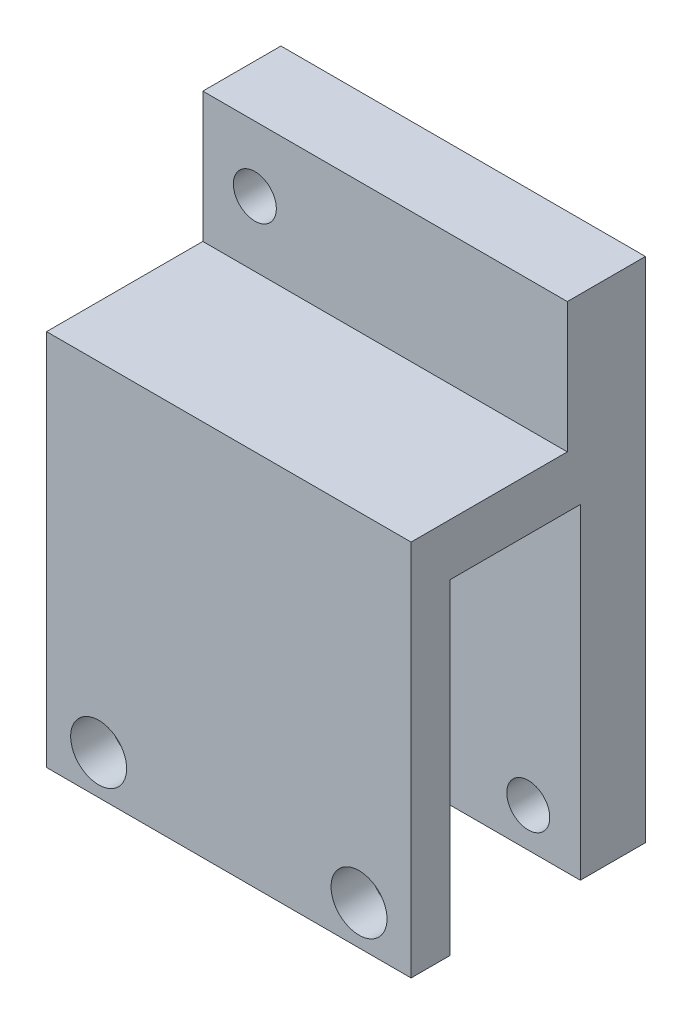
ISO-10303-21;
HEADER;
FILE_DESCRIPTION(('STEP AP214'),'2;1');
FILE_NAME('part.step','',(''),(''),'','','');
FILE_SCHEMA(('AUTOMOTIVE_DESIGN { 1 0 10303 214 1 1 1 1 }'));
ENDSEC;
DATA;
#1=APPLICATION_CONTEXT('core data for automotive mechanical design processes');
#2=APPLICATION_PROTOCOL_DEFINITION('international standard','automotive_design',2000,#1);
#3=PRODUCT_CONTEXT('',#1,'mechanical');
#4=PRODUCT('Part','Part','',(#3));
#5=PRODUCT_RELATED_PRODUCT_CATEGORY('part','',(#4));
#6=PRODUCT_DEFINITION_FORMATION('','',#4);
#7=PRODUCT_DEFINITION_CONTEXT('part definition',#1,'design');
#8=PRODUCT_DEFINITION('design','',#6,#7);
#9=PRODUCT_DEFINITION_SHAPE('','',#8);
#10=(LENGTH_UNIT() NAMED_UNIT(*) SI_UNIT(.MILLI.,.METRE.));
#11=(NAMED_UNIT(*) PLANE_ANGLE_UNIT() SI_UNIT($,.RADIAN.));
#12=(NAMED_UNIT(*) SI_UNIT($,.STERADIAN.) SOLID_ANGLE_UNIT());
#13=UNCERTAINTY_MEASURE_WITH_UNIT(LENGTH_MEASURE(1.E-05),#10,'distance_accuracy_value','');
#14=(GEOMETRIC_REPRESENTATION_CONTEXT(3) GLOBAL_UNCERTAINTY_ASSIGNED_CONTEXT((#13)) GLOBAL_UNIT_ASSIGNED_CONTEXT((#10,
#11,#12)) REPRESENTATION_CONTEXT('',''));
#15=CARTESIAN_POINT('',(0.,0.,0.));
#16=DIRECTION('',(0.,0.,1.));
#17=DIRECTION('',(1.,0.,0.));
#18=AXIS2_PLACEMENT_3D('',#15,#16,#17);
#19=CARTESIAN_POINT('',(14.,0.,0.));
#20=DIRECTION('',(0.,0.,1.));
#21=DIRECTION('',(1.,0.,0.));
#22=AXIS2_PLACEMENT_3D('',#19,#20,#21);
#23=PLANE('',#22);
#24=CARTESIAN_POINT('',(-10.,3.,0.));
#25=DIRECTION('',(0.,0.,-1.));
#26=DIRECTION('',(-1.,0.,0.));
#27=AXIS2_PLACEMENT_3D('',#24,#25,#26);
#28=CIRCLE('',#27,1.64999999999999);
#29=CARTESIAN_POINT('',(-11.65,3.,0.));
#30=VERTEX_POINT('',#29);
#31=EDGE_CURVE('E255',#30,#30,#28,.T.);
#32=ORIENTED_EDGE('',*,*,#31,.F.);
#33=EDGE_LOOP('',(#32));
#34=FACE_BOUND('',#33,.T.);
#35=CARTESIAN_POINT('',(10.,3.,0.));
#36=DIRECTION('',(0.,0.,-1.));
#37=DIRECTION('',(-1.,0.,0.));
#38=AXIS2_PLACEMENT_3D('',#35,#36,#37);
#39=CIRCLE('',#38,1.64999999999999);
#40=CARTESIAN_POINT('',(8.35000000000002,3.,0.));
#41=VERTEX_POINT('',#40);
#42=EDGE_CURVE('E249',#41,#41,#39,.T.);
#43=ORIENTED_EDGE('',*,*,#42,.F.);
#44=EDGE_LOOP('',(#43));
#45=FACE_BOUND('',#44,.T.);
#46=CARTESIAN_POINT('',(-9.99999999999999,34.,0.));
#47=DIRECTION('',(0.,0.,1.));
#48=DIRECTION('',(1.,0.,0.));
#49=AXIS2_PLACEMENT_3D('',#46,#47,#48);
#50=CIRCLE('',#49,1.65);
#51=CARTESIAN_POINT('',(-8.35,34.,0.));
#52=VERTEX_POINT('',#51);
#53=EDGE_CURVE('E172',#52,#52,#50,.T.);
#54=ORIENTED_EDGE('',*,*,#53,.T.);
#55=EDGE_LOOP('',(#54));
#56=FACE_BOUND('',#55,.T.);
#57=DIRECTION('',(0.,1.,0.));
#58=VECTOR('',#57,1.);
#59=CARTESIAN_POINT('',(-14.,0.,0.));
#60=LINE('',#59,#58);
#61=CARTESIAN_POINT('',(-14.,0.,0.));
#62=VERTEX_POINT('',#61);
#63=CARTESIAN_POINT('',(-14.,39.,0.));
#64=VERTEX_POINT('',#63);
#65=EDGE_CURVE('E167',#62,#64,#60,.T.);
#66=ORIENTED_EDGE('',*,*,#65,.T.);
#67=DIRECTION('',(-1.,0.,0.));
#68=VECTOR('',#67,1.);
#69=CARTESIAN_POINT('',(14.,39.,0.));
#70=LINE('',#69,#68);
#71=CARTESIAN_POINT('',(14.,39.,0.));
#72=VERTEX_POINT('',#71);
#73=EDGE_CURVE('E13',#72,#64,#70,.T.);
#74=ORIENTED_EDGE('',*,*,#73,.F.);
#75=DIRECTION('',(0.,1.,0.));
#76=VECTOR('',#75,1.);
#77=CARTESIAN_POINT('',(14.,0.,0.));
#78=LINE('',#77,#76);
#79=CARTESIAN_POINT('',(14.,0.,0.));
#80=VERTEX_POINT('',#79);
#81=EDGE_CURVE('E191',#80,#72,#78,.T.);
#82=ORIENTED_EDGE('',*,*,#81,.F.);
#83=DIRECTION('',(-1.,0.,0.));
#84=VECTOR('',#83,1.);
#85=CARTESIAN_POINT('',(14.,0.,0.));
#86=LINE('',#85,#84);
#87=EDGE_CURVE('E163',#80,#62,#86,.T.);
#88=ORIENTED_EDGE('',*,*,#87,.T.);
#89=EDGE_LOOP('',(#66,#74,#82,#88));
#90=FACE_BOUND('',#89,.T.);
#91=ADVANCED_FACE('F56',(#34,#45,#56,#90),#23,.F.);
#92=CARTESIAN_POINT('',(14.,39.,0.));
#93=DIRECTION('',(0.,-1.,0.));
#94=DIRECTION('',(0.,0.,-1.));
#95=AXIS2_PLACEMENT_3D('',#92,#93,#94);
#96=PLANE('',#95);
#97=DIRECTION('',(0.,0.,1.));
#98=VECTOR('',#97,1.);
#99=CARTESIAN_POINT('',(-14.,39.,0.));
#100=LINE('',#99,#98);
#101=CARTESIAN_POINT('',(-14.,39.,6.));
#102=VERTEX_POINT('',#101);
#103=EDGE_CURVE('E171',#64,#102,#100,.T.);
#104=ORIENTED_EDGE('',*,*,#103,.T.);
#105=DIRECTION('',(-1.,0.,0.));
#106=VECTOR('',#105,1.);
#107=CARTESIAN_POINT('',(14.,39.,6.));
#108=LINE('',#107,#106);
#109=CARTESIAN_POINT('',(14.,39.,6.));
#110=VERTEX_POINT('',#109);
#111=EDGE_CURVE('E64',#110,#102,#108,.T.);
#112=ORIENTED_EDGE('',*,*,#111,.F.);
#113=DIRECTION('',(0.,0.,1.));
#114=VECTOR('',#113,1.);
#115=CARTESIAN_POINT('',(14.,39.,0.));
#116=LINE('',#115,#114);
#117=EDGE_CURVE('E123',#72,#110,#116,.T.);
#118=ORIENTED_EDGE('',*,*,#117,.F.);
#119=ORIENTED_EDGE('',*,*,#73,.T.);
#120=EDGE_LOOP('',(#104,#112,#118,#119));
#121=FACE_BOUND('',#120,.T.);
#122=ADVANCED_FACE('F295',(#121),#96,.F.);
#123=CARTESIAN_POINT('',(14.,39.,6.));
#124=DIRECTION('',(0.,0.,-1.));
#125=DIRECTION('',(0.,1.,0.));
#126=AXIS2_PLACEMENT_3D('',#123,#124,#125);
#127=PLANE('',#126);
#128=CARTESIAN_POINT('',(-9.99999999999999,34.,5.99999999999999));
#129=DIRECTION('',(0.,0.,1.));
#130=DIRECTION('',(1.,0.,0.));
#131=AXIS2_PLACEMENT_3D('',#128,#129,#130);
#132=CIRCLE('',#131,1.65);
#133=CARTESIAN_POINT('',(-8.35,34.,5.99999999999999));
#134=VERTEX_POINT('',#133);
#135=EDGE_CURVE('E243',#134,#134,#132,.T.);
#136=ORIENTED_EDGE('',*,*,#135,.F.);
#137=EDGE_LOOP('',(#136));
#138=FACE_BOUND('',#137,.T.);
#139=DIRECTION('',(0.,-1.,0.));
#140=VECTOR('',#139,1.);
#141=CARTESIAN_POINT('',(-14.,39.,6.));
#142=LINE('',#141,#140);
#143=CARTESIAN_POINT('',(-14.,29.,6.));
#144=VERTEX_POINT('',#143);
#145=EDGE_CURVE('E174',#102,#144,#142,.T.);
#146=ORIENTED_EDGE('',*,*,#145,.T.);
#147=DIRECTION('',(-1.,0.,0.));
#148=VECTOR('',#147,1.);
#149=CARTESIAN_POINT('',(14.,29.,6.));
#150=LINE('',#149,#148);
#151=CARTESIAN_POINT('',(14.,29.,6.));
#152=VERTEX_POINT('',#151);
#153=EDGE_CURVE('E204',#152,#144,#150,.T.);
#154=ORIENTED_EDGE('',*,*,#153,.F.);
#155=DIRECTION('',(0.,-1.,0.));
#156=VECTOR('',#155,1.);
#157=CARTESIAN_POINT('',(14.,39.,6.));
#158=LINE('',#157,#156);
#159=EDGE_CURVE('E213',#110,#152,#158,.T.);
#160=ORIENTED_EDGE('',*,*,#159,.F.);
#161=ORIENTED_EDGE('',*,*,#111,.T.);
#162=EDGE_LOOP('',(#146,#154,#160,#161));
#163=FACE_BOUND('',#162,.T.);
#164=ADVANCED_FACE('F211',(#138,#163),#127,.F.);
#165=CARTESIAN_POINT('',(14.,29.,18.));
#166=DIRECTION('',(0.,-1.,0.));
#167=DIRECTION('',(0.,0.,-1.));
#168=AXIS2_PLACEMENT_3D('',#165,#166,#167);
#169=PLANE('',#168);
#170=DIRECTION('',(0.,0.,1.));
#171=VECTOR('',#170,1.);
#172=CARTESIAN_POINT('',(-14.,29.,18.));
#173=LINE('',#172,#171);
#174=CARTESIAN_POINT('',(-14.,29.,18.));
#175=VERTEX_POINT('',#174);
#176=EDGE_CURVE('E177',#144,#175,#173,.T.);
#177=ORIENTED_EDGE('',*,*,#176,.T.);
#178=DIRECTION('',(-1.,0.,0.));
#179=VECTOR('',#178,1.);
#180=CARTESIAN_POINT('',(14.,29.,18.));
#181=LINE('',#180,#179);
#182=CARTESIAN_POINT('',(14.,29.,18.));
#183=VERTEX_POINT('',#182);
#184=EDGE_CURVE('E201',#183,#175,#181,.T.);
#185=ORIENTED_EDGE('',*,*,#184,.F.);
#186=DIRECTION('',(0.,0.,1.));
#187=VECTOR('',#186,1.);
#188=CARTESIAN_POINT('',(14.,29.,18.));
#189=LINE('',#188,#187);
#190=EDGE_CURVE('E232',#152,#183,#189,.T.);
#191=ORIENTED_EDGE('',*,*,#190,.F.);
#192=ORIENTED_EDGE('',*,*,#153,.T.);
#193=EDGE_LOOP('',(#177,#185,#191,#192));
#194=FACE_BOUND('',#193,.T.);
#195=ADVANCED_FACE('F222',(#194),#169,.F.);
#196=CARTESIAN_POINT('',(14.,0.,18.));
#197=DIRECTION('',(0.,0.,-1.));
#198=DIRECTION('',(-1.,0.,0.));
#199=AXIS2_PLACEMENT_3D('',#196,#197,#198);
#200=PLANE('',#199);
#201=CARTESIAN_POINT('',(-10.,3.,18.));
#202=DIRECTION('',(0.,0.,1.));
#203=DIRECTION('',(1.,0.,0.));
#204=AXIS2_PLACEMENT_3D('',#201,#202,#203);
#205=CIRCLE('',#204,2.15);
#206=CARTESIAN_POINT('',(-7.85000000000001,3.,18.));
#207=VERTEX_POINT('',#206);
#208=EDGE_CURVE('E267',#207,#207,#205,.T.);
#209=ORIENTED_EDGE('',*,*,#208,.F.);
#210=EDGE_LOOP('',(#209));
#211=FACE_BOUND('',#210,.T.);
#212=CARTESIAN_POINT('',(10.,3.,18.));
#213=DIRECTION('',(0.,0.,1.));
#214=DIRECTION('',(1.,0.,0.));
#215=AXIS2_PLACEMENT_3D('',#212,#213,#214);
#216=CIRCLE('',#215,2.15);
#217=CARTESIAN_POINT('',(12.15,3.,18.));
#218=VERTEX_POINT('',#217);
#219=EDGE_CURVE('E261',#218,#218,#216,.T.);
#220=ORIENTED_EDGE('',*,*,#219,.F.);
#221=EDGE_LOOP('',(#220));
#222=FACE_BOUND('',#221,.T.);
#223=DIRECTION('',(0.,-1.,0.));
#224=VECTOR('',#223,1.);
#225=CARTESIAN_POINT('',(-14.,0.,18.));
#226=LINE('',#225,#224);
#227=CARTESIAN_POINT('',(-14.,0.,18.));
#228=VERTEX_POINT('',#227);
#229=EDGE_CURVE('E180',#175,#228,#226,.T.);
#230=ORIENTED_EDGE('',*,*,#229,.T.);
#231=DIRECTION('',(-1.,0.,0.));
#232=VECTOR('',#231,1.);
#233=CARTESIAN_POINT('',(14.,0.,18.));
#234=LINE('',#233,#232);
#235=CARTESIAN_POINT('',(14.,0.,18.));
#236=VERTEX_POINT('',#235);
#237=EDGE_CURVE('E198',#236,#228,#234,.T.);
#238=ORIENTED_EDGE('',*,*,#237,.F.);
#239=DIRECTION('',(0.,-1.,0.));
#240=VECTOR('',#239,1.);
#241=CARTESIAN_POINT('',(14.,0.,18.));
#242=LINE('',#241,#240);
#243=EDGE_CURVE('E228',#183,#236,#242,.T.);
#244=ORIENTED_EDGE('',*,*,#243,.F.);
#245=ORIENTED_EDGE('',*,*,#184,.T.);
#246=EDGE_LOOP('',(#230,#238,#244,#245));
#247=FACE_BOUND('',#246,.T.);
#248=ADVANCED_FACE('F226',(#211,#222,#247),#200,.F.);
#249=CARTESIAN_POINT('',(14.,0.,15.));
#250=DIRECTION('',(0.,1.,0.));
#251=DIRECTION('',(0.,0.,1.));
#252=AXIS2_PLACEMENT_3D('',#249,#250,#251);
#253=PLANE('',#252);
#254=DIRECTION('',(0.,0.,-1.));
#255=VECTOR('',#254,1.);
#256=CARTESIAN_POINT('',(-14.,0.,15.));
#257=LINE('',#256,#255);
#258=CARTESIAN_POINT('',(-14.,0.,15.));
#259=VERTEX_POINT('',#258);
#260=EDGE_CURVE('E182',#228,#259,#257,.T.);
#261=ORIENTED_EDGE('',*,*,#260,.T.);
#262=DIRECTION('',(-1.,0.,0.));
#263=VECTOR('',#262,1.);
#264=CARTESIAN_POINT('',(14.,0.,15.));
#265=LINE('',#264,#263);
#266=CARTESIAN_POINT('',(14.,0.,15.));
#267=VERTEX_POINT('',#266);
#268=EDGE_CURVE('E195',#267,#259,#265,.T.);
#269=ORIENTED_EDGE('',*,*,#268,.F.);
#270=DIRECTION('',(0.,0.,-1.));
#271=VECTOR('',#270,1.);
#272=CARTESIAN_POINT('',(14.,0.,15.));
#273=LINE('',#272,#271);
#274=EDGE_CURVE('E231',#236,#267,#273,.T.);
#275=ORIENTED_EDGE('',*,*,#274,.F.);
#276=ORIENTED_EDGE('',*,*,#237,.T.);
#277=EDGE_LOOP('',(#261,#269,#275,#276));
#278=FACE_BOUND('',#277,.T.);
#279=ADVANCED_FACE('F275',(#278),#253,.F.);
#280=CARTESIAN_POINT('',(14.,0.,15.));
#281=DIRECTION('',(0.,0.,1.));
#282=DIRECTION('',(1.,0.,0.));
#283=AXIS2_PLACEMENT_3D('',#280,#281,#282);
#284=PLANE('',#283);
#285=CARTESIAN_POINT('',(-10.,3.,15.));
#286=DIRECTION('',(0.,0.,1.));
#287=DIRECTION('',(1.,0.,0.));
#288=AXIS2_PLACEMENT_3D('',#285,#286,#287);
#289=CIRCLE('',#288,2.15);
#290=CARTESIAN_POINT('',(-7.85000000000001,3.,15.));
#291=VERTEX_POINT('',#290);
#292=EDGE_CURVE('E264',#291,#291,#289,.T.);
#293=ORIENTED_EDGE('',*,*,#292,.T.);
#294=EDGE_LOOP('',(#293));
#295=FACE_BOUND('',#294,.T.);
#296=CARTESIAN_POINT('',(10.,3.,15.));
#297=DIRECTION('',(0.,0.,1.));
#298=DIRECTION('',(1.,0.,0.));
#299=AXIS2_PLACEMENT_3D('',#296,#297,#298);
#300=CIRCLE('',#299,2.15);
#301=CARTESIAN_POINT('',(12.15,3.,15.));
#302=VERTEX_POINT('',#301);
#303=EDGE_CURVE('E258',#302,#302,#300,.T.);
#304=ORIENTED_EDGE('',*,*,#303,.T.);
#305=EDGE_LOOP('',(#304));
#306=FACE_BOUND('',#305,.T.);
#307=DIRECTION('',(0.,1.,0.));
#308=VECTOR('',#307,1.);
#309=CARTESIAN_POINT('',(-14.,0.,15.));
#310=LINE('',#309,#308);
#311=CARTESIAN_POINT('',(-14.,25.,15.));
#312=VERTEX_POINT('',#311);
#313=EDGE_CURVE('E184',#259,#312,#310,.T.);
#314=ORIENTED_EDGE('',*,*,#313,.T.);
#315=DIRECTION('',(-1.,0.,0.));
#316=VECTOR('',#315,1.);
#317=CARTESIAN_POINT('',(14.,25.,15.));
#318=LINE('',#317,#316);
#319=CARTESIAN_POINT('',(14.,25.,15.));
#320=VERTEX_POINT('',#319);
#321=EDGE_CURVE('E158',#320,#312,#318,.T.);
#322=ORIENTED_EDGE('',*,*,#321,.F.);
#323=DIRECTION('',(0.,1.,0.));
#324=VECTOR('',#323,1.);
#325=CARTESIAN_POINT('',(14.,0.,15.));
#326=LINE('',#325,#324);
#327=EDGE_CURVE('E148',#267,#320,#326,.T.);
#328=ORIENTED_EDGE('',*,*,#327,.F.);
#329=ORIENTED_EDGE('',*,*,#268,.T.);
#330=EDGE_LOOP('',(#314,#322,#328,#329));
#331=FACE_BOUND('',#330,.T.);
#332=ADVANCED_FACE('F310',(#295,#306,#331),#284,.F.);
#333=CARTESIAN_POINT('',(14.,25.,15.));
#334=DIRECTION('',(0.,1.,0.));
#335=DIRECTION('',(0.,0.,1.));
#336=AXIS2_PLACEMENT_3D('',#333,#334,#335);
#337=PLANE('',#336);
#338=DIRECTION('',(0.,0.,-1.));
#339=VECTOR('',#338,1.);
#340=CARTESIAN_POINT('',(-14.,25.,15.));
#341=LINE('',#340,#339);
#342=CARTESIAN_POINT('',(-14.,25.,5.));
#343=VERTEX_POINT('',#342);
#344=EDGE_CURVE('E156',#312,#343,#341,.T.);
#345=ORIENTED_EDGE('',*,*,#344,.T.);
#346=DIRECTION('',(-1.,0.,0.));
#347=VECTOR('',#346,1.);
#348=CARTESIAN_POINT('',(14.,25.,5.));
#349=LINE('',#348,#347);
#350=CARTESIAN_POINT('',(14.,25.,5.));
#351=VERTEX_POINT('',#350);
#352=EDGE_CURVE('E153',#351,#343,#349,.T.);
#353=ORIENTED_EDGE('',*,*,#352,.F.);
#354=DIRECTION('',(0.,0.,-1.));
#355=VECTOR('',#354,1.);
#356=CARTESIAN_POINT('',(14.,25.,15.));
#357=LINE('',#356,#355);
#358=EDGE_CURVE('E142',#320,#351,#357,.T.);
#359=ORIENTED_EDGE('',*,*,#358,.F.);
#360=ORIENTED_EDGE('',*,*,#321,.T.);
#361=EDGE_LOOP('',(#345,#353,#359,#360));
#362=FACE_BOUND('',#361,.T.);
#363=ADVANCED_FACE('F154',(#362),#337,.F.);
#364=CARTESIAN_POINT('',(14.,0.,5.));
#365=DIRECTION('',(0.,0.,-1.));
#366=DIRECTION('',(-1.,0.,0.));
#367=AXIS2_PLACEMENT_3D('',#364,#365,#366);
#368=PLANE('',#367);
#369=CARTESIAN_POINT('',(-10.,3.,5.));
#370=DIRECTION('',(0.,0.,-1.));
#371=DIRECTION('',(-1.,0.,0.));
#372=AXIS2_PLACEMENT_3D('',#369,#370,#371);
#373=CIRCLE('',#372,1.64999999999999);
#374=CARTESIAN_POINT('',(-11.65,3.,5.));
#375=VERTEX_POINT('',#374);
#376=EDGE_CURVE('E252',#375,#375,#373,.T.);
#377=ORIENTED_EDGE('',*,*,#376,.T.);
#378=EDGE_LOOP('',(#377));
#379=FACE_BOUND('',#378,.T.);
#380=CARTESIAN_POINT('',(10.,3.,5.));
#381=DIRECTION('',(0.,0.,-1.));
#382=DIRECTION('',(-1.,0.,0.));
#383=AXIS2_PLACEMENT_3D('',#380,#381,#382);
#384=CIRCLE('',#383,1.64999999999999);
#385=CARTESIAN_POINT('',(8.35000000000001,3.,5.));
#386=VERTEX_POINT('',#385);
#387=EDGE_CURVE('E246',#386,#386,#384,.T.);
#388=ORIENTED_EDGE('',*,*,#387,.T.);
#389=EDGE_LOOP('',(#388));
#390=FACE_BOUND('',#389,.T.);
#391=DIRECTION('',(0.,-1.,0.));
#392=VECTOR('',#391,1.);
#393=CARTESIAN_POINT('',(-14.,0.,5.));
#394=LINE('',#393,#392);
#395=CARTESIAN_POINT('',(-14.,0.,5.));
#396=VERTEX_POINT('',#395);
#397=EDGE_CURVE('E109',#343,#396,#394,.T.);
#398=ORIENTED_EDGE('',*,*,#397,.T.);
#399=DIRECTION('',(-1.,0.,0.));
#400=VECTOR('',#399,1.);
#401=CARTESIAN_POINT('',(14.,0.,5.));
#402=LINE('',#401,#400);
#403=CARTESIAN_POINT('',(14.,0.,5.));
#404=VERTEX_POINT('',#403);
#405=EDGE_CURVE('E159',#404,#396,#402,.T.);
#406=ORIENTED_EDGE('',*,*,#405,.F.);
#407=DIRECTION('',(0.,-1.,0.));
#408=VECTOR('',#407,1.);
#409=CARTESIAN_POINT('',(14.,0.,5.));
#410=LINE('',#409,#408);
#411=EDGE_CURVE('E146',#351,#404,#410,.T.);
#412=ORIENTED_EDGE('',*,*,#411,.F.);
#413=ORIENTED_EDGE('',*,*,#352,.T.);
#414=EDGE_LOOP('',(#398,#406,#412,#413));
#415=FACE_BOUND('',#414,.T.);
#416=ADVANCED_FACE('F161',(#379,#390,#415),#368,.F.);
#417=CARTESIAN_POINT('',(14.,0.,0.));
#418=DIRECTION('',(0.,1.,0.));
#419=DIRECTION('',(0.,0.,1.));
#420=AXIS2_PLACEMENT_3D('',#417,#418,#419);
#421=PLANE('',#420);
#422=DIRECTION('',(0.,0.,-1.));
#423=VECTOR('',#422,1.);
#424=CARTESIAN_POINT('',(-14.,0.,0.));
#425=LINE('',#424,#423);
#426=EDGE_CURVE('E115',#396,#62,#425,.T.);
#427=ORIENTED_EDGE('',*,*,#426,.T.);
#428=ORIENTED_EDGE('',*,*,#87,.F.);
#429=DIRECTION('',(0.,0.,-1.));
#430=VECTOR('',#429,1.);
#431=CARTESIAN_POINT('',(14.,0.,0.));
#432=LINE('',#431,#430);
#433=EDGE_CURVE('E72',#404,#80,#432,.T.);
#434=ORIENTED_EDGE('',*,*,#433,.F.);
#435=ORIENTED_EDGE('',*,*,#405,.T.);
#436=EDGE_LOOP('',(#427,#428,#434,#435));
#437=FACE_BOUND('',#436,.T.);
#438=ADVANCED_FACE('F343',(#437),#421,.F.);
#439=CARTESIAN_POINT('',(14.,0.,0.));
#440=DIRECTION('',(1.,0.,0.));
#441=DIRECTION('',(0.,0.,-1.));
#442=AXIS2_PLACEMENT_3D('',#439,#440,#441);
#443=PLANE('',#442);
#444=ORIENTED_EDGE('',*,*,#81,.T.);
#445=ORIENTED_EDGE('',*,*,#117,.T.);
#446=ORIENTED_EDGE('',*,*,#159,.T.);
#447=ORIENTED_EDGE('',*,*,#190,.T.);
#448=ORIENTED_EDGE('',*,*,#243,.T.);
#449=ORIENTED_EDGE('',*,*,#274,.T.);
#450=ORIENTED_EDGE('',*,*,#327,.T.);
#451=ORIENTED_EDGE('',*,*,#358,.T.);
#452=ORIENTED_EDGE('',*,*,#411,.T.);
#453=ORIENTED_EDGE('',*,*,#433,.T.);
#454=EDGE_LOOP('',(#444,#445,#446,#447,#448,#449,#450,#451,#452,#453));
#455=FACE_BOUND('',#454,.T.);
#456=ADVANCED_FACE('F144',(#455),#443,.T.);
#457=CARTESIAN_POINT('',(-14.,0.,0.));
#458=DIRECTION('',(1.,0.,0.));
#459=DIRECTION('',(0.,0.,-1.));
#460=AXIS2_PLACEMENT_3D('',#457,#458,#459);
#461=PLANE('',#460);
#462=ORIENTED_EDGE('',*,*,#65,.F.);
#463=ORIENTED_EDGE('',*,*,#426,.F.);
#464=ORIENTED_EDGE('',*,*,#397,.F.);
#465=ORIENTED_EDGE('',*,*,#344,.F.);
#466=ORIENTED_EDGE('',*,*,#313,.F.);
#467=ORIENTED_EDGE('',*,*,#260,.F.);
#468=ORIENTED_EDGE('',*,*,#229,.F.);
#469=ORIENTED_EDGE('',*,*,#176,.F.);
#470=ORIENTED_EDGE('',*,*,#145,.F.);
#471=ORIENTED_EDGE('',*,*,#103,.F.);
#472=EDGE_LOOP('',(#462,#463,#464,#465,#466,#467,#468,#469,#470,#471));
#473=FACE_BOUND('',#472,.T.);
#474=ADVANCED_FACE('F217',(#473),#461,.F.);
#475=CARTESIAN_POINT('',(-9.99999999999999,34.,5.99999999999999));
#476=DIRECTION('',(0.,0.,1.));
#477=DIRECTION('',(1.,0.,0.));
#478=AXIS2_PLACEMENT_3D('',#475,#476,#477);
#479=CYLINDRICAL_SURFACE('',#478,1.65);
#480=ORIENTED_EDGE('',*,*,#53,.F.);
#481=EDGE_LOOP('',(#480));
#482=FACE_BOUND('',#481,.T.);
#483=ORIENTED_EDGE('',*,*,#135,.T.);
#484=EDGE_LOOP('',(#483));
#485=FACE_BOUND('',#484,.T.);
#486=ADVANCED_FACE('F330',(#482,#485),#479,.F.);
#487=CARTESIAN_POINT('',(10.,3.,0.));
#488=DIRECTION('',(0.,0.,-1.));
#489=DIRECTION('',(-1.,0.,0.));
#490=AXIS2_PLACEMENT_3D('',#487,#488,#489);
#491=CYLINDRICAL_SURFACE('',#490,1.64999999999999);
#492=ORIENTED_EDGE('',*,*,#387,.F.);
#493=EDGE_LOOP('',(#492));
#494=FACE_BOUND('',#493,.T.);
#495=ORIENTED_EDGE('',*,*,#42,.T.);
#496=EDGE_LOOP('',(#495));
#497=FACE_BOUND('',#496,.T.);
#498=ADVANCED_FACE('F290',(#494,#497),#491,.F.);
#499=CARTESIAN_POINT('',(-10.,3.,0.));
#500=DIRECTION('',(0.,0.,-1.));
#501=DIRECTION('',(-1.,0.,0.));
#502=AXIS2_PLACEMENT_3D('',#499,#500,#501);
#503=CYLINDRICAL_SURFACE('',#502,1.64999999999999);
#504=ORIENTED_EDGE('',*,*,#376,.F.);
#505=EDGE_LOOP('',(#504));
#506=FACE_BOUND('',#505,.T.);
#507=ORIENTED_EDGE('',*,*,#31,.T.);
#508=EDGE_LOOP('',(#507));
#509=FACE_BOUND('',#508,.T.);
#510=ADVANCED_FACE('F281',(#506,#509),#503,.F.);
#511=CARTESIAN_POINT('',(10.,3.,18.));
#512=DIRECTION('',(0.,0.,1.));
#513=DIRECTION('',(1.,0.,0.));
#514=AXIS2_PLACEMENT_3D('',#511,#512,#513);
#515=CYLINDRICAL_SURFACE('',#514,2.15);
#516=ORIENTED_EDGE('',*,*,#303,.F.);
#517=EDGE_LOOP('',(#516));
#518=FACE_BOUND('',#517,.T.);
#519=ORIENTED_EDGE('',*,*,#219,.T.);
#520=EDGE_LOOP('',(#519));
#521=FACE_BOUND('',#520,.T.);
#522=ADVANCED_FACE('F279',(#518,#521),#515,.F.);
#523=CARTESIAN_POINT('',(-10.,3.,18.));
#524=DIRECTION('',(0.,0.,1.));
#525=DIRECTION('',(1.,0.,0.));
#526=AXIS2_PLACEMENT_3D('',#523,#524,#525);
#527=CYLINDRICAL_SURFACE('',#526,2.15);
#528=ORIENTED_EDGE('',*,*,#292,.F.);
#529=EDGE_LOOP('',(#528));
#530=FACE_BOUND('',#529,.T.);
#531=ORIENTED_EDGE('',*,*,#208,.T.);
#532=EDGE_LOOP('',(#531));
#533=FACE_BOUND('',#532,.T.);
#534=ADVANCED_FACE('F271',(#530,#533),#527,.F.);
#535=CLOSED_SHELL('',(#91,#122,#164,#195,#248,#279,#332,#363,#416,#438,#456,#474,#486,#498,#510,
#522,#534));
#536=MANIFOLD_SOLID_BREP('B2',#535);
#537=ADVANCED_BREP_SHAPE_REPRESENTATION('',(#18,#536),#14);
#538=SHAPE_DEFINITION_REPRESENTATION(#9,#537);
ENDSEC;
END-ISO-10303-21;
